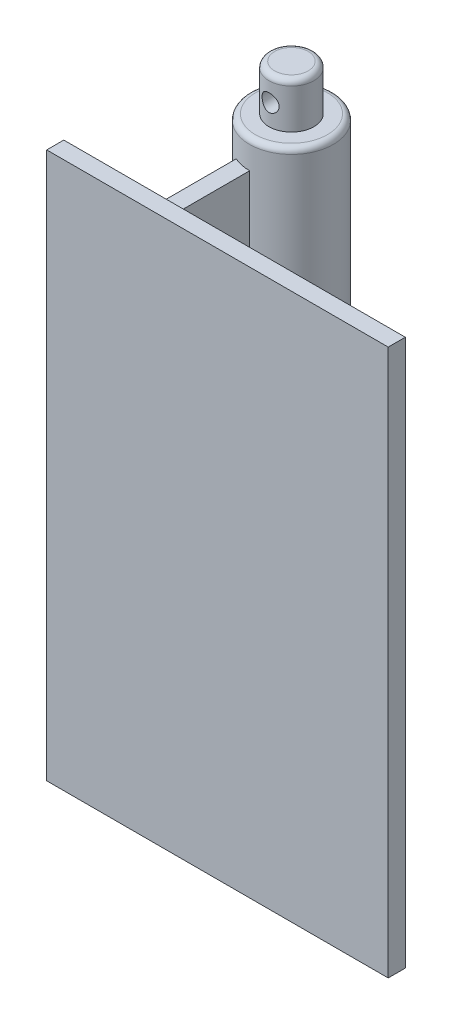
ISO-10303-21;
HEADER;
FILE_DESCRIPTION(('STEP AP214'),'2;1');
FILE_NAME('part.step','',(''),(''),'','','');
FILE_SCHEMA(('AUTOMOTIVE_DESIGN { 1 0 10303 214 1 1 1 1 }'));
ENDSEC;
DATA;
#1=APPLICATION_CONTEXT('core data for automotive mechanical design processes');
#2=APPLICATION_PROTOCOL_DEFINITION('international standard','automotive_design',2000,#1);
#3=PRODUCT_CONTEXT('',#1,'mechanical');
#4=PRODUCT('Part','Part','',(#3));
#5=PRODUCT_RELATED_PRODUCT_CATEGORY('part','',(#4));
#6=PRODUCT_DEFINITION_FORMATION('','',#4);
#7=PRODUCT_DEFINITION_CONTEXT('part definition',#1,'design');
#8=PRODUCT_DEFINITION('design','',#6,#7);
#9=PRODUCT_DEFINITION_SHAPE('','',#8);
#10=(LENGTH_UNIT() NAMED_UNIT(*) SI_UNIT(.MILLI.,.METRE.));
#11=(NAMED_UNIT(*) PLANE_ANGLE_UNIT() SI_UNIT($,.RADIAN.));
#12=(NAMED_UNIT(*) SI_UNIT($,.STERADIAN.) SOLID_ANGLE_UNIT());
#13=UNCERTAINTY_MEASURE_WITH_UNIT(LENGTH_MEASURE(1.E-05),#10,'distance_accuracy_value','');
#14=(GEOMETRIC_REPRESENTATION_CONTEXT(3) GLOBAL_UNCERTAINTY_ASSIGNED_CONTEXT((#13)) GLOBAL_UNIT_ASSIGNED_CONTEXT((#10,
#11,#12)) REPRESENTATION_CONTEXT('',''));
#15=CARTESIAN_POINT('',(0.,0.,0.));
#16=DIRECTION('',(0.,0.,1.));
#17=DIRECTION('',(1.,0.,0.));
#18=AXIS2_PLACEMENT_3D('',#15,#16,#17);
#19=CARTESIAN_POINT('',(12.,90.,-38.));
#20=DIRECTION('',(1.,0.,0.));
#21=DIRECTION('',(0.,1.,0.));
#22=AXIS2_PLACEMENT_3D('',#19,#20,#21);
#23=PLANE('',#22);
#24=DIRECTION('',(0.,0.,1.));
#25=VECTOR('',#24,1.);
#26=CARTESIAN_POINT('',(12.,6.,-38.));
#27=LINE('',#26,#25);
#28=CARTESIAN_POINT('',(12.,6.00000000000001,-18.2901192260965));
#29=VERTEX_POINT('',#28);
#30=CARTESIAN_POINT('',(12.,6.,-3.));
#31=VERTEX_POINT('',#30);
#32=EDGE_CURVE('E119',#29,#31,#27,.T.);
#33=ORIENTED_EDGE('',*,*,#32,.T.);
#34=DIRECTION('',(0.,1.,0.));
#35=VECTOR('',#34,1.);
#36=CARTESIAN_POINT('',(12.,90.,-3.));
#37=LINE('',#36,#35);
#38=CARTESIAN_POINT('',(12.,90.,-3.));
#39=VERTEX_POINT('',#38);
#40=EDGE_CURVE('E258',#31,#39,#37,.T.);
#41=ORIENTED_EDGE('',*,*,#40,.T.);
#42=DIRECTION('',(0.,0.,1.));
#43=VECTOR('',#42,1.);
#44=CARTESIAN_POINT('',(12.,90.,-38.));
#45=LINE('',#44,#43);
#46=CARTESIAN_POINT('',(12.,90.,-18.2901192260965));
#47=VERTEX_POINT('',#46);
#48=EDGE_CURVE('E138',#47,#39,#45,.T.);
#49=ORIENTED_EDGE('',*,*,#48,.F.);
#50=DIRECTION('',(0.,-1.,0.));
#51=VECTOR('',#50,1.);
#52=CARTESIAN_POINT('',(12.,95.,-18.2901192260965));
#53=LINE('',#52,#51);
#54=EDGE_CURVE('E136',#29,#47,#53,.F.);
#55=ORIENTED_EDGE('',*,*,#54,.F.);
#56=EDGE_LOOP('',(#33,#41,#49,#55));
#57=FACE_BOUND('',#56,.T.);
#58=ADVANCED_FACE('F43',(#57),#23,.F.);
#59=CARTESIAN_POINT('',(15.,6.,-38.));
#60=DIRECTION('',(-1.,0.,0.));
#61=DIRECTION('',(0.,0.,1.));
#62=AXIS2_PLACEMENT_3D('',#59,#60,#61);
#63=PLANE('',#62);
#64=DIRECTION('',(0.,0.,1.));
#65=VECTOR('',#64,1.);
#66=CARTESIAN_POINT('',(15.,90.,-38.));
#67=LINE('',#66,#65);
#68=CARTESIAN_POINT('',(15.,90.,-17.65));
#69=VERTEX_POINT('',#68);
#70=CARTESIAN_POINT('',(15.,90.,-3.));
#71=VERTEX_POINT('',#70);
#72=EDGE_CURVE('E408',#69,#71,#67,.T.);
#73=ORIENTED_EDGE('',*,*,#72,.T.);
#74=DIRECTION('',(0.,-1.,0.));
#75=VECTOR('',#74,1.);
#76=CARTESIAN_POINT('',(15.,6.,-3.));
#77=LINE('',#76,#75);
#78=CARTESIAN_POINT('',(15.,6.,-3.));
#79=VERTEX_POINT('',#78);
#80=EDGE_CURVE('E262',#71,#79,#77,.T.);
#81=ORIENTED_EDGE('',*,*,#80,.T.);
#82=DIRECTION('',(0.,0.,1.));
#83=VECTOR('',#82,1.);
#84=CARTESIAN_POINT('',(15.,6.,-38.));
#85=LINE('',#84,#83);
#86=CARTESIAN_POINT('',(15.,6.00000000000001,-17.65));
#87=VERTEX_POINT('',#86);
#88=EDGE_CURVE('E131',#87,#79,#85,.T.);
#89=ORIENTED_EDGE('',*,*,#88,.F.);
#90=DIRECTION('',(0.,-1.,0.));
#91=VECTOR('',#90,1.);
#92=CARTESIAN_POINT('',(15.,95.,-17.65));
#93=LINE('',#92,#91);
#94=EDGE_CURVE('E146',#69,#87,#93,.T.);
#95=ORIENTED_EDGE('',*,*,#94,.F.);
#96=EDGE_LOOP('',(#73,#81,#89,#95));
#97=FACE_BOUND('',#96,.T.);
#98=ADVANCED_FACE('F208',(#97),#63,.F.);
#99=CARTESIAN_POINT('',(12.,6.,-38.));
#100=DIRECTION('',(0.,1.,0.));
#101=DIRECTION('',(0.,0.,1.));
#102=AXIS2_PLACEMENT_3D('',#99,#100,#101);
#103=PLANE('',#102);
#104=CARTESIAN_POINT('',(15.,6.00000000000001,-25.));
#105=DIRECTION('',(0.,1.,0.));
#106=DIRECTION('',(0.,0.,1.));
#107=AXIS2_PLACEMENT_3D('',#104,#105,#106);
#108=CIRCLE('',#107,7.35);
#109=EDGE_CURVE('E124',#87,#29,#108,.F.);
#110=ORIENTED_EDGE('',*,*,#109,.F.);
#111=ORIENTED_EDGE('',*,*,#88,.T.);
#112=CARTESIAN_POINT('',(18.,6.,-3.));
#113=DIRECTION('',(0.,1.,0.));
#114=DIRECTION('',(0.,0.,1.));
#115=AXIS2_PLACEMENT_3D('',#112,#113,#114);
#116=CIRCLE('',#115,3.);
#117=CARTESIAN_POINT('',(18.,6.,0.));
#118=VERTEX_POINT('',#117);
#119=EDGE_CURVE('E51',#79,#118,#116,.T.);
#120=ORIENTED_EDGE('',*,*,#119,.T.);
#121=DIRECTION('',(-1.,0.,0.));
#122=VECTOR('',#121,1.);
#123=CARTESIAN_POINT('',(12.,6.,0.));
#124=LINE('',#123,#122);
#125=CARTESIAN_POINT('',(8.99999999999996,6.,0.));
#126=VERTEX_POINT('',#125);
#127=EDGE_CURVE('E132',#118,#126,#124,.T.);
#128=ORIENTED_EDGE('',*,*,#127,.T.);
#129=CARTESIAN_POINT('',(8.99999999999996,6.00000000000001,-3.));
#130=DIRECTION('',(0.,1.,0.));
#131=DIRECTION('',(0.,0.,1.));
#132=AXIS2_PLACEMENT_3D('',#129,#130,#131);
#133=CIRCLE('',#132,3.);
#134=EDGE_CURVE('E127',#126,#31,#133,.T.);
#135=ORIENTED_EDGE('',*,*,#134,.T.);
#136=ORIENTED_EDGE('',*,*,#32,.F.);
#137=EDGE_LOOP('',(#110,#111,#120,#128,#135,#136));
#138=FACE_BOUND('',#137,.T.);
#139=ADVANCED_FACE('F121',(#138),#103,.F.);
#140=CARTESIAN_POINT('',(0.,0.,0.));
#141=DIRECTION('',(0.,0.,-1.));
#142=DIRECTION('',(-1.,0.,0.));
#143=AXIS2_PLACEMENT_3D('',#140,#141,#142);
#144=PLANE('',#143);
#145=DIRECTION('',(0.,-1.,0.));
#146=VECTOR('',#145,1.);
#147=CARTESIAN_POINT('',(0.,0.,0.));
#148=LINE('',#147,#146);
#149=CARTESIAN_POINT('',(0.,96.,0.));
#150=VERTEX_POINT('',#149);
#151=CARTESIAN_POINT('',(0.,0.,0.));
#152=VERTEX_POINT('',#151);
#153=EDGE_CURVE('E417',#150,#152,#148,.T.);
#154=ORIENTED_EDGE('',*,*,#153,.F.);
#155=DIRECTION('',(-1.,0.,0.));
#156=VECTOR('',#155,1.);
#157=CARTESIAN_POINT('',(0.,96.,0.));
#158=LINE('',#157,#156);
#159=CARTESIAN_POINT('',(60.,96.,0.));
#160=VERTEX_POINT('',#159);
#161=EDGE_CURVE('E422',#160,#150,#158,.T.);
#162=ORIENTED_EDGE('',*,*,#161,.F.);
#163=DIRECTION('',(0.,1.,0.));
#164=VECTOR('',#163,1.);
#165=CARTESIAN_POINT('',(60.,0.,0.));
#166=LINE('',#165,#164);
#167=CARTESIAN_POINT('',(60.,0.,0.));
#168=VERTEX_POINT('',#167);
#169=EDGE_CURVE('E433',#168,#160,#166,.T.);
#170=ORIENTED_EDGE('',*,*,#169,.F.);
#171=DIRECTION('',(1.,0.,0.));
#172=VECTOR('',#171,1.);
#173=CARTESIAN_POINT('',(0.,0.,0.));
#174=LINE('',#173,#172);
#175=EDGE_CURVE('E431',#152,#168,#174,.T.);
#176=ORIENTED_EDGE('',*,*,#175,.F.);
#177=EDGE_LOOP('',(#154,#162,#170,#176));
#178=FACE_BOUND('',#177,.T.);
#179=DIRECTION('',(1.,0.,0.));
#180=VECTOR('',#179,1.);
#181=CARTESIAN_POINT('',(15.,90.,0.));
#182=LINE('',#181,#180);
#183=CARTESIAN_POINT('',(8.99999999999997,90.,0.));
#184=VERTEX_POINT('',#183);
#185=CARTESIAN_POINT('',(18.,90.,0.));
#186=VERTEX_POINT('',#185);
#187=EDGE_CURVE('E141',#184,#186,#182,.T.);
#188=ORIENTED_EDGE('',*,*,#187,.F.);
#189=DIRECTION('',(0.,1.,0.));
#190=VECTOR('',#189,1.);
#191=CARTESIAN_POINT('',(8.99999999999996,0.,0.));
#192=LINE('',#191,#190);
#193=EDGE_CURVE('E257',#184,#126,#192,.F.);
#194=ORIENTED_EDGE('',*,*,#193,.T.);
#195=ORIENTED_EDGE('',*,*,#127,.F.);
#196=DIRECTION('',(0.,-1.,0.));
#197=VECTOR('',#196,1.);
#198=CARTESIAN_POINT('',(18.,0.,0.));
#199=LINE('',#198,#197);
#200=EDGE_CURVE('E267',#118,#186,#199,.F.);
#201=ORIENTED_EDGE('',*,*,#200,.T.);
#202=EDGE_LOOP('',(#188,#194,#195,#201));
#203=FACE_BOUND('',#202,.T.);
#204=ADVANCED_FACE('F224',(#178,#203),#144,.T.);
#205=CARTESIAN_POINT('',(0.,0.,3.));
#206=DIRECTION('',(1.,0.,0.));
#207=DIRECTION('',(0.,1.,0.));
#208=AXIS2_PLACEMENT_3D('',#205,#206,#207);
#209=PLANE('',#208);
#210=ORIENTED_EDGE('',*,*,#153,.T.);
#211=DIRECTION('',(0.,0.,-1.));
#212=VECTOR('',#211,1.);
#213=CARTESIAN_POINT('',(0.,0.,3.));
#214=LINE('',#213,#212);
#215=CARTESIAN_POINT('',(0.,0.,3.));
#216=VERTEX_POINT('',#215);
#217=EDGE_CURVE('E148',#216,#152,#214,.T.);
#218=ORIENTED_EDGE('',*,*,#217,.F.);
#219=DIRECTION('',(0.,-1.,0.));
#220=VECTOR('',#219,1.);
#221=CARTESIAN_POINT('',(0.,0.,3.));
#222=LINE('',#221,#220);
#223=CARTESIAN_POINT('',(0.,96.,3.));
#224=VERTEX_POINT('',#223);
#225=EDGE_CURVE('E418',#224,#216,#222,.T.);
#226=ORIENTED_EDGE('',*,*,#225,.F.);
#227=DIRECTION('',(0.,0.,-1.));
#228=VECTOR('',#227,1.);
#229=CARTESIAN_POINT('',(0.,96.,3.));
#230=LINE('',#229,#228);
#231=EDGE_CURVE('E428',#224,#150,#230,.T.);
#232=ORIENTED_EDGE('',*,*,#231,.T.);
#233=EDGE_LOOP('',(#210,#218,#226,#232));
#234=FACE_BOUND('',#233,.T.);
#235=ADVANCED_FACE('F227',(#234),#209,.F.);
#236=CARTESIAN_POINT('',(0.,0.,3.));
#237=DIRECTION('',(0.,1.,0.));
#238=DIRECTION('',(0.,0.,1.));
#239=AXIS2_PLACEMENT_3D('',#236,#237,#238);
#240=PLANE('',#239);
#241=ORIENTED_EDGE('',*,*,#175,.T.);
#242=DIRECTION('',(0.,0.,-1.));
#243=VECTOR('',#242,1.);
#244=CARTESIAN_POINT('',(60.,0.,3.));
#245=LINE('',#244,#243);
#246=CARTESIAN_POINT('',(60.,0.,3.));
#247=VERTEX_POINT('',#246);
#248=EDGE_CURVE('E154',#247,#168,#245,.T.);
#249=ORIENTED_EDGE('',*,*,#248,.F.);
#250=DIRECTION('',(1.,0.,0.));
#251=VECTOR('',#250,1.);
#252=CARTESIAN_POINT('',(0.,0.,3.));
#253=LINE('',#252,#251);
#254=EDGE_CURVE('E421',#216,#247,#253,.T.);
#255=ORIENTED_EDGE('',*,*,#254,.F.);
#256=ORIENTED_EDGE('',*,*,#217,.T.);
#257=EDGE_LOOP('',(#241,#249,#255,#256));
#258=FACE_BOUND('',#257,.T.);
#259=ADVANCED_FACE('F235',(#258),#240,.F.);
#260=CARTESIAN_POINT('',(60.,0.,3.));
#261=DIRECTION('',(-1.,0.,0.));
#262=DIRECTION('',(0.,-1.,0.));
#263=AXIS2_PLACEMENT_3D('',#260,#261,#262);
#264=PLANE('',#263);
#265=ORIENTED_EDGE('',*,*,#169,.T.);
#266=DIRECTION('',(0.,0.,-1.));
#267=VECTOR('',#266,1.);
#268=CARTESIAN_POINT('',(60.,96.,3.));
#269=LINE('',#268,#267);
#270=CARTESIAN_POINT('',(60.,96.,3.));
#271=VERTEX_POINT('',#270);
#272=EDGE_CURVE('E438',#271,#160,#269,.T.);
#273=ORIENTED_EDGE('',*,*,#272,.F.);
#274=DIRECTION('',(0.,1.,0.));
#275=VECTOR('',#274,1.);
#276=CARTESIAN_POINT('',(60.,0.,3.));
#277=LINE('',#276,#275);
#278=EDGE_CURVE('E424',#247,#271,#277,.T.);
#279=ORIENTED_EDGE('',*,*,#278,.F.);
#280=ORIENTED_EDGE('',*,*,#248,.T.);
#281=EDGE_LOOP('',(#265,#273,#279,#280));
#282=FACE_BOUND('',#281,.T.);
#283=ADVANCED_FACE('F231',(#282),#264,.F.);
#284=CARTESIAN_POINT('',(0.,96.,3.));
#285=DIRECTION('',(0.,-1.,0.));
#286=DIRECTION('',(0.,0.,-1.));
#287=AXIS2_PLACEMENT_3D('',#284,#285,#286);
#288=PLANE('',#287);
#289=ORIENTED_EDGE('',*,*,#161,.T.);
#290=ORIENTED_EDGE('',*,*,#231,.F.);
#291=DIRECTION('',(-1.,0.,0.));
#292=VECTOR('',#291,1.);
#293=CARTESIAN_POINT('',(0.,96.,3.));
#294=LINE('',#293,#292);
#295=EDGE_CURVE('E426',#271,#224,#294,.T.);
#296=ORIENTED_EDGE('',*,*,#295,.F.);
#297=ORIENTED_EDGE('',*,*,#272,.T.);
#298=EDGE_LOOP('',(#289,#290,#296,#297));
#299=FACE_BOUND('',#298,.T.);
#300=ADVANCED_FACE('F222',(#299),#288,.F.);
#301=CARTESIAN_POINT('',(0.,0.,3.));
#302=DIRECTION('',(0.,0.,-1.));
#303=DIRECTION('',(-1.,0.,0.));
#304=AXIS2_PLACEMENT_3D('',#301,#302,#303);
#305=PLANE('',#304);
#306=ORIENTED_EDGE('',*,*,#225,.T.);
#307=ORIENTED_EDGE('',*,*,#254,.T.);
#308=ORIENTED_EDGE('',*,*,#278,.T.);
#309=ORIENTED_EDGE('',*,*,#295,.T.);
#310=EDGE_LOOP('',(#306,#307,#308,#309));
#311=FACE_BOUND('',#310,.T.);
#312=ADVANCED_FACE('F219',(#311),#305,.F.);
#313=CARTESIAN_POINT('',(15.,90.,-38.));
#314=DIRECTION('',(0.,-1.,0.));
#315=DIRECTION('',(0.,0.,-1.));
#316=AXIS2_PLACEMENT_3D('',#313,#314,#315);
#317=PLANE('',#316);
#318=CARTESIAN_POINT('',(15.,90.,-25.));
#319=DIRECTION('',(0.,-1.,0.));
#320=DIRECTION('',(0.,0.,-1.));
#321=AXIS2_PLACEMENT_3D('',#318,#319,#320);
#322=CIRCLE('',#321,7.35);
#323=EDGE_CURVE('E142',#47,#69,#322,.F.);
#324=ORIENTED_EDGE('',*,*,#323,.F.);
#325=ORIENTED_EDGE('',*,*,#48,.T.);
#326=CARTESIAN_POINT('',(8.99999999999997,90.,-3.));
#327=DIRECTION('',(0.,-1.,0.));
#328=DIRECTION('',(0.,0.,-1.));
#329=AXIS2_PLACEMENT_3D('',#326,#327,#328);
#330=CIRCLE('',#329,3.);
#331=EDGE_CURVE('E259',#39,#184,#330,.T.);
#332=ORIENTED_EDGE('',*,*,#331,.T.);
#333=ORIENTED_EDGE('',*,*,#187,.T.);
#334=CARTESIAN_POINT('',(18.,90.,-3.));
#335=DIRECTION('',(0.,-1.,0.));
#336=DIRECTION('',(0.,0.,-1.));
#337=AXIS2_PLACEMENT_3D('',#334,#335,#336);
#338=CIRCLE('',#337,3.);
#339=EDGE_CURVE('E11',#186,#71,#338,.T.);
#340=ORIENTED_EDGE('',*,*,#339,.T.);
#341=ORIENTED_EDGE('',*,*,#72,.F.);
#342=EDGE_LOOP('',(#324,#325,#332,#333,#340,#341));
#343=FACE_BOUND('',#342,.T.);
#344=ADVANCED_FACE('F218',(#343),#317,.F.);
#345=CARTESIAN_POINT('',(15.,95.,-25.));
#346=DIRECTION('',(0.,-1.,0.));
#347=DIRECTION('',(0.,0.,-1.));
#348=AXIS2_PLACEMENT_3D('',#345,#346,#347);
#349=CYLINDRICAL_SURFACE('',#348,7.35);
#350=CARTESIAN_POINT('',(15.,-3.62201126458976,-25.));
#351=DIRECTION('',(0.,1.,0.));
#352=DIRECTION('',(-1.,0.,0.));
#353=AXIS2_PLACEMENT_3D('',#350,#351,#352);
#354=CIRCLE('',#353,7.35);
#355=CARTESIAN_POINT('',(7.64999999999999,-3.62201126458976,-25.));
#356=VERTEX_POINT('',#355);
#357=EDGE_CURVE('E271',#356,#356,#354,.T.);
#358=ORIENTED_EDGE('',*,*,#357,.T.);
#359=EDGE_LOOP('',(#358));
#360=FACE_BOUND('',#359,.T.);
#361=CARTESIAN_POINT('',(15.,94.,-25.));
#362=DIRECTION('',(0.,1.,0.));
#363=DIRECTION('',(0.,0.,1.));
#364=AXIS2_PLACEMENT_3D('',#361,#362,#363);
#365=CIRCLE('',#364,7.35);
#366=CARTESIAN_POINT('',(15.,94.,-17.65));
#367=VERTEX_POINT('',#366);
#368=EDGE_CURVE('E166',#367,#367,#365,.F.);
#369=ORIENTED_EDGE('',*,*,#368,.T.);
#370=EDGE_LOOP('',(#369));
#371=FACE_BOUND('',#370,.T.);
#372=ORIENTED_EDGE('',*,*,#109,.T.);
#373=ORIENTED_EDGE('',*,*,#54,.T.);
#374=ORIENTED_EDGE('',*,*,#323,.T.);
#375=ORIENTED_EDGE('',*,*,#94,.T.);
#376=EDGE_LOOP('',(#372,#373,#374,#375));
#377=FACE_BOUND('',#376,.T.);
#378=ADVANCED_FACE('F145',(#360,#371,#377),#349,.T.);
#379=CARTESIAN_POINT('',(15.,95.,-25.));
#380=DIRECTION('',(0.,1.,0.));
#381=DIRECTION('',(0.,0.,1.));
#382=AXIS2_PLACEMENT_3D('',#379,#380,#381);
#383=PLANE('',#382);
#384=CARTESIAN_POINT('',(15.,95.,-25.));
#385=DIRECTION('',(0.,1.,0.));
#386=DIRECTION('',(0.,0.,1.));
#387=AXIS2_PLACEMENT_3D('',#384,#385,#386);
#388=CIRCLE('',#387,6.35);
#389=CARTESIAN_POINT('',(15.,95.,-18.65));
#390=VERTEX_POINT('',#389);
#391=EDGE_CURVE('E163',#390,#390,#388,.T.);
#392=ORIENTED_EDGE('',*,*,#391,.T.);
#393=EDGE_LOOP('',(#392));
#394=FACE_BOUND('',#393,.T.);
#395=CARTESIAN_POINT('',(14.9999999999998,95.,-24.9999999999995));
#396=DIRECTION('',(0.,1.,0.));
#397=DIRECTION('',(0.,0.,1.));
#398=AXIS2_PLACEMENT_3D('',#395,#396,#397);
#399=CIRCLE('',#398,3.95);
#400=CARTESIAN_POINT('',(14.9999999999998,95.,-21.0499999999995));
#401=VERTEX_POINT('',#400);
#402=EDGE_CURVE('E147',#401,#401,#399,.T.);
#403=ORIENTED_EDGE('',*,*,#402,.F.);
#404=EDGE_LOOP('',(#403));
#405=FACE_BOUND('',#404,.T.);
#406=ADVANCED_FACE('F278',(#394,#405),#383,.T.);
#407=CARTESIAN_POINT('',(0.269043897259403,-4.12201126458977,0.159470032160111));
#408=DIRECTION('',(0.,1.,0.));
#409=DIRECTION('',(0.999942461582465,0.,-0.0107272328398589));
#410=AXIS2_PLACEMENT_3D('',#407,#408,#409);
#411=PLANE('',#410);
#412=CARTESIAN_POINT('',(15.,-4.12201126458977,-25.));
#413=DIRECTION('',(0.,1.,0.));
#414=DIRECTION('',(-1.,0.,0.));
#415=AXIS2_PLACEMENT_3D('',#412,#413,#414);
#416=CIRCLE('',#415,6.85);
#417=CARTESIAN_POINT('',(8.14999999999999,-4.12201126458977,-25.));
#418=VERTEX_POINT('',#417);
#419=EDGE_CURVE('E169',#418,#418,#416,.F.);
#420=ORIENTED_EDGE('',*,*,#419,.T.);
#421=EDGE_LOOP('',(#420));
#422=FACE_BOUND('',#421,.T.);
#423=ADVANCED_FACE('F205',(#422),#411,.F.);
#424=CARTESIAN_POINT('',(14.9999999999998,103.,-24.9999999999995));
#425=DIRECTION('',(0.,-1.,0.));
#426=DIRECTION('',(0.,0.,-1.));
#427=AXIS2_PLACEMENT_3D('',#424,#425,#426);
#428=CYLINDRICAL_SURFACE('',#427,3.95);
#429=CARTESIAN_POINT('',(14.9999999999998,100.17798873541,-28.9499999999995));
#430=CARTESIAN_POINT('',(14.9188382184186,100.177991995215,-28.9500024642297));
#431=CARTESIAN_POINT('',(14.8376984647472,100.171381035976,-28.9474769205789));
#432=CARTESIAN_POINT('',(14.6778478434432,100.14522214936,-28.9376549503403));
#433=CARTESIAN_POINT('',(14.5991365608245,100.125676445279,-28.9303593436601));
#434=CARTESIAN_POINT('',(14.4464716206295,100.074441715519,-28.9117791558993));
#435=CARTESIAN_POINT('',(14.3725089721815,100.042776478792,-28.9005023926174));
#436=CARTESIAN_POINT('',(14.2309520789474,99.9683241467149,-28.8750798343882));
#437=CARTESIAN_POINT('',(14.163359594189,99.925533989837,-28.8609332499148));
#438=CARTESIAN_POINT('',(14.0335288433706,99.8281086813638,-28.8305422582574));
#439=CARTESIAN_POINT('',(13.9716033698914,99.7730757233858,-28.8142374437165));
#440=CARTESIAN_POINT('',(13.8576071765479,99.6535714821281,-28.7816609990706));
#441=CARTESIAN_POINT('',(13.8055395857645,99.5890972134737,-28.7653893811187));
#442=CARTESIAN_POINT('',(13.7107226341185,99.4494547531172,-28.7340139807829));
#443=CARTESIAN_POINT('',(13.6684194677018,99.3739660505329,-28.7189811472666));
#444=CARTESIAN_POINT('',(13.5972491009094,99.2162851458402,-28.6927279418792));
#445=CARTESIAN_POINT('',(13.5683763781683,99.1340957153218,-28.6815060035473));
#446=CARTESIAN_POINT('',(13.5261285368883,98.9689504995138,-28.6647923008312));
#447=CARTESIAN_POINT('',(13.5121553858124,98.8861707498665,-28.6590803734497));
#448=CARTESIAN_POINT('',(13.4982337154417,98.7192594814042,-28.6533902534417));
#449=CARTESIAN_POINT('',(13.4982792129917,98.635128554602,-28.6534096147027));
#450=CARTESIAN_POINT('',(13.5119370428937,98.4734242607008,-28.6589904370708));
#451=CARTESIAN_POINT('',(13.5247131869138,98.3957662715966,-28.6642103093522));
#452=CARTESIAN_POINT('',(13.5620850745512,98.2437925846353,-28.6790352704854));
#453=CARTESIAN_POINT('',(13.5866826448148,98.1694774052505,-28.6886410370339));
#454=CARTESIAN_POINT('',(13.6474482503224,98.0246177866717,-28.7113568161828));
#455=CARTESIAN_POINT('',(13.6838295486548,97.9541732521125,-28.7245306217029));
#456=CARTESIAN_POINT('',(13.7669810449546,97.8201489548894,-28.7528775768475));
#457=CARTESIAN_POINT('',(13.8137548933846,97.7565716160712,-28.7680514282397));
#458=CARTESIAN_POINT('',(13.9201659808153,97.6334672439081,-28.7999666944869));
#459=CARTESIAN_POINT('',(13.9804684837181,97.5745231347972,-28.8167439972124));
#460=CARTESIAN_POINT('',(14.1102929994662,97.4674084665306,-28.8490767862669));
#461=CARTESIAN_POINT('',(14.1798164994815,97.4192396485966,-28.8646320748626));
#462=CARTESIAN_POINT('',(14.3276271334903,97.3343778867576,-28.893091604615));
#463=CARTESIAN_POINT('',(14.4060381125745,97.2978837337005,-28.9059487583243));
#464=CARTESIAN_POINT('',(14.5684967665976,97.238799269797,-28.9272128831301));
#465=CARTESIAN_POINT('',(14.6525418521138,97.2162026196195,-28.935621883002));
#466=CARTESIAN_POINT('',(14.8189806418308,97.1866860290469,-28.9466831653289));
#467=CARTESIAN_POINT('',(14.9012161815626,97.1789814191137,-28.9496232620737));
#468=CARTESIAN_POINT('',(15.0658484188421,97.1771768469682,-28.9503080833161));
#469=CARTESIAN_POINT('',(15.1482450752724,97.1830737765589,-28.9480539947788));
#470=CARTESIAN_POINT('',(15.3074391393202,97.2077119465277,-28.9387933799194));
#471=CARTESIAN_POINT('',(15.3843290559311,97.2259351596397,-28.931978638703));
#472=CARTESIAN_POINT('',(15.5339028125363,97.2740223118751,-28.9144759898249));
#473=CARTESIAN_POINT('',(15.6065861046733,97.3038877633462,-28.9037875789793));
#474=CARTESIAN_POINT('',(15.7481004569603,97.3753697415241,-28.8791957153859));
#475=CARTESIAN_POINT('',(15.8167533756158,97.4173084631528,-28.8652063250684));
#476=CARTESIAN_POINT('',(15.9462797229843,97.5113836315997,-28.8355543061161));
#477=CARTESIAN_POINT('',(16.0071502148119,97.5635239095482,-28.8198910498775));
#478=CARTESIAN_POINT('',(16.1231754210418,97.6801716000269,-28.7874557356838));
#479=CARTESIAN_POINT('',(16.1777743273675,97.7452303732541,-28.7706731688414));
#480=CARTESIAN_POINT('',(16.2753944917805,97.8839110472407,-28.7387850504236));
#481=CARTESIAN_POINT('',(16.3184145644737,97.9575338236441,-28.7236796706447));
#482=CARTESIAN_POINT('',(16.3917379473137,98.1119470451761,-28.6969047731033));
#483=CARTESIAN_POINT('',(16.4219754645379,98.1927720419321,-28.6852531215953));
#484=CARTESIAN_POINT('',(16.4682059146255,98.3589345735795,-28.6670833492012));
#485=CARTESIAN_POINT('',(16.4842079683956,98.4442691818953,-28.6605619415899));
#486=CARTESIAN_POINT('',(16.5006872960534,98.6109888250315,-28.6538348847936));
#487=CARTESIAN_POINT('',(16.5021154693034,98.6922650040783,-28.6532424422992));
#488=CARTESIAN_POINT('',(16.4918540266949,98.8538352097054,-28.6574447112528));
#489=CARTESIAN_POINT('',(16.4801657218202,98.9341293336306,-28.662238884312));
#490=CARTESIAN_POINT('',(16.4447505304818,99.0888348409384,-28.6763485735749));
#491=CARTESIAN_POINT('',(16.4214221547168,99.1633523260449,-28.6855140039445));
#492=CARTESIAN_POINT('',(16.3637439954591,99.3074567544146,-28.707242553388));
#493=CARTESIAN_POINT('',(16.3293913928708,99.3770424309619,-28.7198065414056));
#494=CARTESIAN_POINT('',(16.2485138647777,99.5133474631837,-28.747750544578));
#495=CARTESIAN_POINT('',(16.2014371406444,99.5797156260938,-28.7632450661525));
#496=CARTESIAN_POINT('',(16.0972928577378,99.7039133685259,-28.7949187580043));
#497=CARTESIAN_POINT('',(16.0402220828133,99.7617401883107,-28.8110981474018));
#498=CARTESIAN_POINT('',(15.9138876153773,99.8705227332791,-28.8434081697665));
#499=CARTESIAN_POINT('',(15.8441197429192,99.9209115250619,-28.8594852212448));
#500=CARTESIAN_POINT('',(15.6965400388454,100.009239101708,-28.8888286234488));
#501=CARTESIAN_POINT('',(15.6187272305823,100.04717637263,-28.9020946323191));
#502=CARTESIAN_POINT('',(15.4527760423605,100.110925613725,-28.9249034205145));
#503=CARTESIAN_POINT('',(15.364306841726,100.135970990485,-28.9342060796982));
#504=CARTESIAN_POINT('',(15.1838810781279,100.169496269406,-28.9467513511912));
#505=CARTESIAN_POINT('',(15.0919264097606,100.177985043252,-28.9499972089341));
#506=CARTESIAN_POINT('',(14.9999999999998,100.17798873541,-28.9499999999995));
#507=B_SPLINE_CURVE_WITH_KNOTS('',3,(#429,#430,#431,#432,#433,#434,#435,#436,#437,#438,#439,
#440,#441,#442,#443,#444,#445,#446,#447,#448,#449,#450,#451,#452,#453,#454,#455,#456,#457,#458,
#459,#460,#461,#462,#463,#464,#465,#466,#467,#468,#469,#470,#471,#472,#473,#474,#475,#476,#477,
#478,#479,#480,#481,#482,#483,#484,#485,#486,#487,#488,#489,#490,#491,#492,#493,#494,#495,#496,
#497,#498,#499,#500,#501,#502,#503,#504,#505,#506),.UNSPECIFIED.,.T.,.F.,(4,2,2,2,2,2,2,2,2,2,2,
2,2,2,2,2,2,2,2,2,2,2,2,2,2,2,2,2,2,2,2,2,2,2,2,2,2,2,4),(0.,0.243146193662997,
0.486250604858374,0.728880263111803,0.97157676275917,1.22376512608258,1.47603340511198,
1.73820774038464,2.0002741786208,2.25137261277041,2.50236387832667,2.73788855879894,
2.97344964424191,3.21353744444614,3.45370971102292,3.71046812044703,3.96726799055135,
4.22823275106619,4.48907838432734,4.73575910951624,4.98238346929789,5.21923881371646,
5.45612493632834,5.7000354666674,5.94403777249992,6.2025624056296,6.46111349540771,
6.7209796281366,6.98067913998999,7.22331650944356,7.46592962960196,7.70075432825631,
7.93563912377423,8.18306000325451,8.430560651212,8.69193629902898,8.95334371493506,
9.22888649827887,9.50428159428321),.UNSPECIFIED.);
#508=CARTESIAN_POINT('',(14.9999999999998,100.17798873541,-28.9499999999995));
#509=VERTEX_POINT('',#508);
#510=EDGE_CURVE('E178',#509,#509,#507,.T.);
#511=ORIENTED_EDGE('',*,*,#510,.T.);
#512=EDGE_LOOP('',(#511));
#513=FACE_BOUND('',#512,.T.);
#514=CARTESIAN_POINT('',(13.4999999999998,98.6779887354103,-21.3458927218808));
#515=CARTESIAN_POINT('',(13.4999965759153,98.7589113283758,-21.3458959629377));
#516=CARTESIAN_POINT('',(13.5065701713922,98.8398117063886,-21.3431754558425));
#517=CARTESIAN_POINT('',(13.5325670422106,98.9991684149255,-21.3326664638089));
#518=CARTESIAN_POINT('',(13.5519896805547,99.0776248664066,-21.3248782301057));
#519=CARTESIAN_POINT('',(13.6028652385147,99.2297460466708,-21.3052405283201));
#520=CARTESIAN_POINT('',(13.6342886716328,99.3034220063319,-21.2934010217571));
#521=CARTESIAN_POINT('',(13.708168999113,99.4444853372865,-21.2670110348734));
#522=CARTESIAN_POINT('',(13.750629295688,99.5118707607445,-21.2524597190051));
#523=CARTESIAN_POINT('',(13.8476970956712,99.6418768188655,-21.2214544008403));
#524=CARTESIAN_POINT('',(13.9027766403957,99.7041315224336,-21.2049434539938));
#525=CARTESIAN_POINT('',(14.0225185854721,99.8187792886051,-21.1723536068296));
#526=CARTESIAN_POINT('',(14.0871830919008,99.8711701781022,-21.1562748023849));
#527=CARTESIAN_POINT('',(14.2270494222887,99.9663786049166,-21.1256818270001));
#528=CARTESIAN_POINT('',(14.302540961666,100.008796624323,-21.1112421699814));
#529=CARTESIAN_POINT('',(14.4602340318537,100.08017815503,-21.0862406532149));
#530=CARTESIAN_POINT('',(14.5424331592401,100.10914646088,-21.0756774118853));
#531=CARTESIAN_POINT('',(14.7073597220147,100.151517575168,-21.0600232992239));
#532=CARTESIAN_POINT('',(14.7899038307755,100.165550762714,-21.0547115426676));
#533=CARTESIAN_POINT('',(14.9563349473083,100.179674982479,-21.0493651263897));
#534=CARTESIAN_POINT('',(15.0402214979475,100.179770663795,-21.0493287069883));
#535=CARTESIAN_POINT('',(15.2024308701676,100.166380252889,-21.0543977010841));
#536=CARTESIAN_POINT('',(15.2808201031131,100.153582695805,-21.0592424471681));
#537=CARTESIAN_POINT('',(15.4342422774608,100.115929705674,-21.0731857677786));
#538=CARTESIAN_POINT('',(15.5092749801327,100.091073416445,-21.0822846443509));
#539=CARTESIAN_POINT('',(15.6551628378542,100.029698073003,-21.1040039535902));
#540=CARTESIAN_POINT('',(15.725940551455,99.9930132596901,-21.1166740939786));
#541=CARTESIAN_POINT('',(15.8605126790246,99.9091704381612,-21.1442583812807));
#542=CARTESIAN_POINT('',(15.9243047996482,99.8620090058063,-21.1591732613414));
#543=CARTESIAN_POINT('',(16.0471442815878,99.7552536661391,-21.1907677606557));
#544=CARTESIAN_POINT('',(16.1056791129639,99.6950845803995,-21.2074995740286));
#545=CARTESIAN_POINT('',(16.2120239513817,99.5656901254435,-21.2401330812157));
#546=CARTESIAN_POINT('',(16.2598311218312,99.4964623685895,-21.2560345546219));
#547=CARTESIAN_POINT('',(16.3443776972942,99.3488438303983,-21.2855408249418));
#548=CARTESIAN_POINT('',(16.3808337148938,99.2702773327077,-21.2990835783344));
#549=CARTESIAN_POINT('',(16.4398020485375,99.1074701226567,-21.3216201202495));
#550=CARTESIAN_POINT('',(16.4623223619244,99.0232326955322,-21.3306165172646));
#551=CARTESIAN_POINT('',(16.4915991852719,98.8565495386281,-21.3424231231718));
#552=CARTESIAN_POINT('',(16.4991719734213,98.7742700349975,-21.345553160639));
#553=CARTESIAN_POINT('',(16.5006985960008,98.6095744203005,-21.3461791536848));
#554=CARTESIAN_POINT('',(16.494655960231,98.5271583501743,-21.3436765695213));
#555=CARTESIAN_POINT('',(16.4698639946504,98.3687787583446,-21.3336447656882));
#556=CARTESIAN_POINT('',(16.4517540849999,98.2926972240855,-21.3263687651952));
#557=CARTESIAN_POINT('',(16.4041507743241,98.1446903296405,-21.3079128421524));
#558=CARTESIAN_POINT('',(16.3746550051824,98.0727658376476,-21.2967321075129));
#559=CARTESIAN_POINT('',(16.3038546722809,97.9320659392547,-21.2712030754661));
#560=CARTESIAN_POINT('',(16.2621430523084,97.8635148809622,-21.2567503342785));
#561=CARTESIAN_POINT('',(16.168524912942,97.7340959483273,-21.2264782018434));
#562=CARTESIAN_POINT('',(16.1166145808621,97.6732309613674,-21.2106583007396));
#563=CARTESIAN_POINT('',(16.000062933392,97.5567871792516,-21.1781860670617));
#564=CARTESIAN_POINT('',(15.9348116088813,97.5018131645558,-21.161546839634));
#565=CARTESIAN_POINT('',(15.7956034838874,97.4035187572834,-21.1302975050462));
#566=CARTESIAN_POINT('',(15.7216466007736,97.3601984753335,-21.1156874171491));
#567=CARTESIAN_POINT('',(15.5671218990224,97.2867061210714,-21.0901432332362));
#568=CARTESIAN_POINT('',(15.4865741096929,97.2564958518279,-21.0791984795781));
#569=CARTESIAN_POINT('',(15.3210279513729,97.2102293075707,-21.0621897520036));
#570=CARTESIAN_POINT('',(15.2360317551159,97.1941661897735,-21.0561234185858));
#571=CARTESIAN_POINT('',(15.0694609071304,97.1774017470656,-21.049783872614));
#572=CARTESIAN_POINT('',(14.9879842240574,97.1758419729351,-21.049186959332));
#573=CARTESIAN_POINT('',(14.8259778570679,97.1859094053434,-21.0530038575145));
#574=CARTESIAN_POINT('',(14.7454480552554,97.1975349522325,-21.0574170383533));
#575=CARTESIAN_POINT('',(14.5897128945613,97.2330377467945,-21.0706078170547));
#576=CARTESIAN_POINT('',(14.5144240979689,97.256594710976,-21.0792711434153));
#577=CARTESIAN_POINT('',(14.3688650308219,97.3149695664681,-21.1000538964038));
#578=CARTESIAN_POINT('',(14.2985957138782,97.3497895906477,-21.1121739775808));
#579=CARTESIAN_POINT('',(14.1617965616858,97.4313832076971,-21.1393025025135));
#580=CARTESIAN_POINT('',(14.0955526519747,97.4786020017281,-21.1544118238639));
#581=CARTESIAN_POINT('',(13.9716659564849,97.5829570033448,-21.1856693712228));
#582=CARTESIAN_POINT('',(13.9140262850683,97.6400967857898,-21.2018179703928));
#583=CARTESIAN_POINT('',(13.8057499108151,97.7663683164685,-21.2344138687577));
#584=CARTESIAN_POINT('',(13.7556653999317,97.8359836147565,-21.2508295558532));
#585=CARTESIAN_POINT('',(13.6678758287808,97.983159382232,-21.2811144584219));
#586=CARTESIAN_POINT('',(13.6301726694992,98.0607210690818,-21.2949832827154));
#587=CARTESIAN_POINT('',(13.5667676189238,98.2262018362757,-21.3190258576476));
#588=CARTESIAN_POINT('',(13.5418367003764,98.3144555900435,-21.3289554440259));
#589=CARTESIAN_POINT('',(13.5084606734012,98.4944803511736,-21.3423847606846));
#590=CARTESIAN_POINT('',(13.5000038817987,98.5862488188305,-21.3458890475758));
#591=CARTESIAN_POINT('',(13.4999999999998,98.6779887354103,-21.3458927218808));
#592=B_SPLINE_CURVE_WITH_KNOTS('',3,(#514,#515,#516,#517,#518,#519,#520,#521,#522,#523,#524,
#525,#526,#527,#528,#529,#530,#531,#532,#533,#534,#535,#536,#537,#538,#539,#540,#541,#542,#543,
#544,#545,#546,#547,#548,#549,#550,#551,#552,#553,#554,#555,#556,#557,#558,#559,#560,#561,#562,
#563,#564,#565,#566,#567,#568,#569,#570,#571,#572,#573,#574,#575,#576,#577,#578,#579,#580,#581,
#582,#583,#584,#585,#586,#587,#588,#589,#590,#591),.UNSPECIFIED.,.T.,.F.,(4,2,2,2,2,2,2,2,2,2,2,
2,2,2,2,2,2,2,2,2,2,2,2,2,2,2,2,2,2,2,2,2,2,2,2,2,2,2,4),(0.,0.242425943440425,
0.484839869399901,0.72666196596649,0.968558694966047,1.22167431118402,1.47484562645702,
1.73688313328173,1.99882715718829,2.24921384178735,2.4995170053892,2.73712638365117,
2.97475263488412,3.21586520293897,3.45705669156448,3.71268448983916,3.96837980139327,
4.23002424392532,4.49151839584408,4.73828729432003,4.984992225297,5.21956625190945,
5.45418909329515,5.6977500218305,5.9414021770251,6.2009658921801,6.4605320712388,
6.71933682403015,6.97801632765158,7.22127958841126,7.4645122327755,7.70153665764071,
7.9386059937733,8.18575257338472,8.43298839358296,8.69368601936149,8.95442365297424,
9.22945098830345,9.50428320774921),.UNSPECIFIED.);
#593=CARTESIAN_POINT('',(13.4999999999998,98.6779887354103,-21.3458927218808));
#594=VERTEX_POINT('',#593);
#595=EDGE_CURVE('E170',#594,#594,#592,.T.);
#596=ORIENTED_EDGE('',*,*,#595,.T.);
#597=EDGE_LOOP('',(#596));
#598=FACE_BOUND('',#597,.T.);
#599=CARTESIAN_POINT('',(14.9999999999998,102.,-24.9999999999995));
#600=DIRECTION('',(0.,1.,0.));
#601=DIRECTION('',(0.,0.,1.));
#602=AXIS2_PLACEMENT_3D('',#599,#600,#601);
#603=CIRCLE('',#602,3.95);
#604=CARTESIAN_POINT('',(14.9999999999998,102.,-21.0499999999995));
#605=VERTEX_POINT('',#604);
#606=EDGE_CURVE('E160',#605,#605,#603,.F.);
#607=ORIENTED_EDGE('',*,*,#606,.T.);
#608=EDGE_LOOP('',(#607));
#609=FACE_BOUND('',#608,.T.);
#610=ORIENTED_EDGE('',*,*,#402,.T.);
#611=EDGE_LOOP('',(#610));
#612=FACE_BOUND('',#611,.T.);
#613=ADVANCED_FACE('F183',(#513,#598,#609,#612),#428,.T.);
#614=CARTESIAN_POINT('',(14.9999999999998,103.,-24.9999999999995));
#615=DIRECTION('',(0.,1.,0.));
#616=DIRECTION('',(0.,0.,1.));
#617=AXIS2_PLACEMENT_3D('',#614,#615,#616);
#618=PLANE('',#617);
#619=CARTESIAN_POINT('',(14.9999999999998,103.,-24.9999999999995));
#620=DIRECTION('',(0.,1.,0.));
#621=DIRECTION('',(0.,0.,1.));
#622=AXIS2_PLACEMENT_3D('',#619,#620,#621);
#623=CIRCLE('',#622,2.95);
#624=CARTESIAN_POINT('',(14.9999999999998,103.,-22.0499999999995));
#625=VERTEX_POINT('',#624);
#626=EDGE_CURVE('E151',#625,#625,#623,.T.);
#627=ORIENTED_EDGE('',*,*,#626,.T.);
#628=EDGE_LOOP('',(#627));
#629=FACE_BOUND('',#628,.T.);
#630=ADVANCED_FACE('F193',(#629),#618,.T.);
#631=CARTESIAN_POINT('',(14.9999999999998,102.,-24.9999999999995));
#632=DIRECTION('',(0.,1.,0.));
#633=DIRECTION('',(0.,0.,1.));
#634=AXIS2_PLACEMENT_3D('',#631,#632,#633);
#635=TOROIDAL_SURFACE('',#634,2.95,1.);
#636=ORIENTED_EDGE('',*,*,#606,.F.);
#637=EDGE_LOOP('',(#636));
#638=FACE_BOUND('',#637,.T.);
#639=ORIENTED_EDGE('',*,*,#626,.F.);
#640=EDGE_LOOP('',(#639));
#641=FACE_BOUND('',#640,.T.);
#642=ADVANCED_FACE('F196',(#638,#641),#635,.T.);
#643=CARTESIAN_POINT('',(15.,94.,-25.));
#644=DIRECTION('',(0.,1.,0.));
#645=DIRECTION('',(0.,0.,1.));
#646=AXIS2_PLACEMENT_3D('',#643,#644,#645);
#647=TOROIDAL_SURFACE('',#646,6.35,1.);
#648=ORIENTED_EDGE('',*,*,#368,.F.);
#649=EDGE_LOOP('',(#648));
#650=FACE_BOUND('',#649,.T.);
#651=ORIENTED_EDGE('',*,*,#391,.F.);
#652=EDGE_LOOP('',(#651));
#653=FACE_BOUND('',#652,.T.);
#654=ADVANCED_FACE('F191',(#650,#653),#647,.T.);
#655=CARTESIAN_POINT('',(14.9999999999998,98.6779887354103,3.));
#656=DIRECTION('',(0.,0.,-1.));
#657=DIRECTION('',(-1.,0.,0.));
#658=AXIS2_PLACEMENT_3D('',#655,#656,#657);
#659=CYLINDRICAL_SURFACE('',#658,1.5);
#660=ORIENTED_EDGE('',*,*,#595,.F.);
#661=EDGE_LOOP('',(#660));
#662=FACE_BOUND('',#661,.T.);
#663=ORIENTED_EDGE('',*,*,#510,.F.);
#664=EDGE_LOOP('',(#663));
#665=FACE_BOUND('',#664,.T.);
#666=ADVANCED_FACE('F187',(#662,#665),#659,.F.);
#667=CARTESIAN_POINT('',(15.,-3.62201126458976,-25.));
#668=DIRECTION('',(0.,1.,0.));
#669=DIRECTION('',(-1.,0.,0.));
#670=AXIS2_PLACEMENT_3D('',#667,#668,#669);
#671=TOROIDAL_SURFACE('',#670,6.85,0.5);
#672=ORIENTED_EDGE('',*,*,#357,.F.);
#673=EDGE_LOOP('',(#672));
#674=FACE_BOUND('',#673,.T.);
#675=ORIENTED_EDGE('',*,*,#419,.F.);
#676=EDGE_LOOP('',(#675));
#677=FACE_BOUND('',#676,.T.);
#678=ADVANCED_FACE('F190',(#674,#677),#671,.T.);
#679=CARTESIAN_POINT('',(8.99999999999997,90.,-3.));
#680=DIRECTION('',(0.,1.,0.));
#681=DIRECTION('',(-1.,0.,0.));
#682=AXIS2_PLACEMENT_3D('',#679,#680,#681);
#683=CYLINDRICAL_SURFACE('',#682,3.);
#684=ORIENTED_EDGE('',*,*,#134,.F.);
#685=ORIENTED_EDGE('',*,*,#193,.F.);
#686=ORIENTED_EDGE('',*,*,#331,.F.);
#687=ORIENTED_EDGE('',*,*,#40,.F.);
#688=EDGE_LOOP('',(#684,#685,#686,#687));
#689=FACE_BOUND('',#688,.T.);
#690=ADVANCED_FACE('F247',(#689),#683,.F.);
#691=CARTESIAN_POINT('',(18.,6.,-3.));
#692=DIRECTION('',(0.,-1.,0.));
#693=DIRECTION('',(0.,0.,-1.));
#694=AXIS2_PLACEMENT_3D('',#691,#692,#693);
#695=CYLINDRICAL_SURFACE('',#694,3.);
#696=ORIENTED_EDGE('',*,*,#339,.F.);
#697=ORIENTED_EDGE('',*,*,#200,.F.);
#698=ORIENTED_EDGE('',*,*,#119,.F.);
#699=ORIENTED_EDGE('',*,*,#80,.F.);
#700=EDGE_LOOP('',(#696,#697,#698,#699));
#701=FACE_BOUND('',#700,.T.);
#702=ADVANCED_FACE('F45',(#701),#695,.F.);
#703=CLOSED_SHELL('',(#58,#98,#139,#204,#235,#259,#283,#300,#312,#344,#378,#406,#423,#613,#630,
#642,#654,#666,#678,#690,#702));
#704=MANIFOLD_SOLID_BREP('B2',#703);
#705=ADVANCED_BREP_SHAPE_REPRESENTATION('',(#18,#704),#14);
#706=SHAPE_DEFINITION_REPRESENTATION(#9,#705);
ENDSEC;
END-ISO-10303-21;
